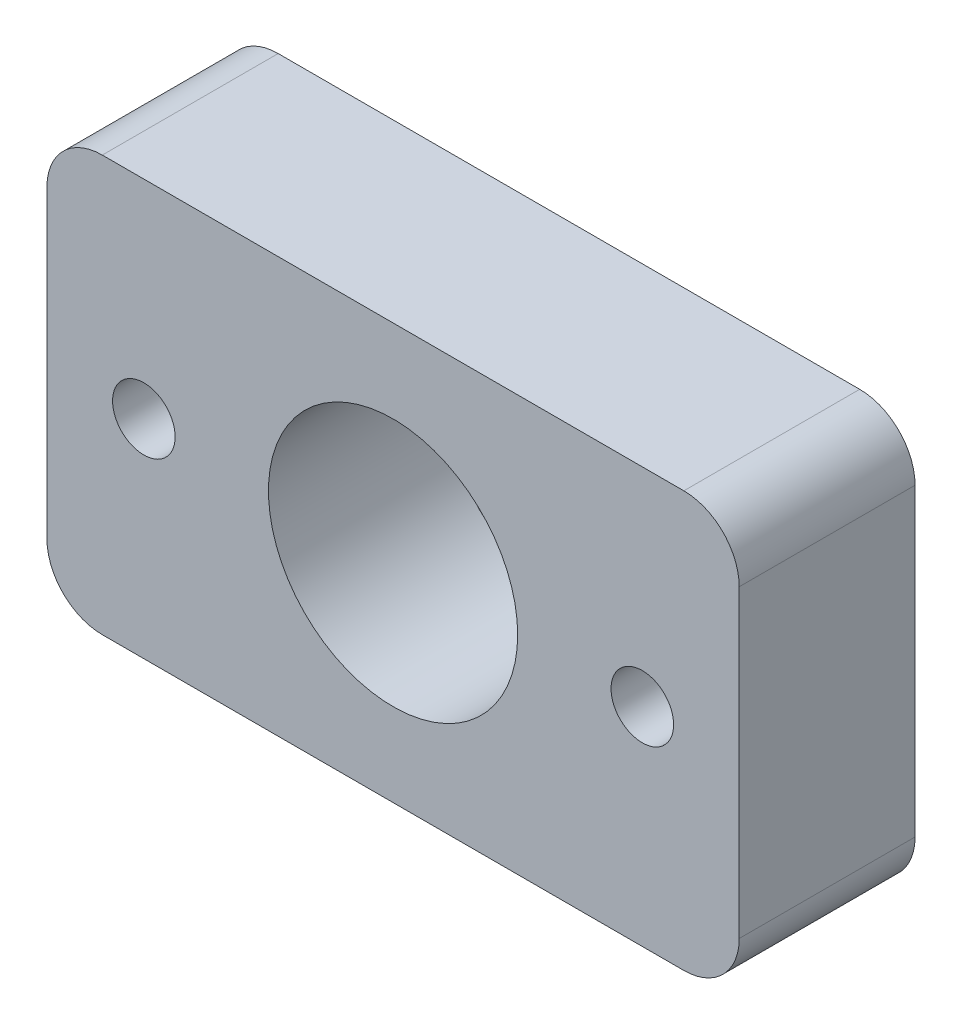
ISO-10303-21;
HEADER;
FILE_DESCRIPTION(('STEP AP214'),'2;1');
FILE_NAME('part.step','',(''),(''),'','','');
FILE_SCHEMA(('AUTOMOTIVE_DESIGN { 1 0 10303 214 1 1 1 1 }'));
ENDSEC;
DATA;
#1=APPLICATION_CONTEXT('core data for automotive mechanical design processes');
#2=APPLICATION_PROTOCOL_DEFINITION('international standard','automotive_design',2000,#1);
#3=PRODUCT_CONTEXT('',#1,'mechanical');
#4=PRODUCT('Part','Part','',(#3));
#5=PRODUCT_RELATED_PRODUCT_CATEGORY('part','',(#4));
#6=PRODUCT_DEFINITION_FORMATION('','',#4);
#7=PRODUCT_DEFINITION_CONTEXT('part definition',#1,'design');
#8=PRODUCT_DEFINITION('design','',#6,#7);
#9=PRODUCT_DEFINITION_SHAPE('','',#8);
#10=(LENGTH_UNIT() NAMED_UNIT(*) SI_UNIT(.MILLI.,.METRE.));
#11=(NAMED_UNIT(*) PLANE_ANGLE_UNIT() SI_UNIT($,.RADIAN.));
#12=(NAMED_UNIT(*) SI_UNIT($,.STERADIAN.) SOLID_ANGLE_UNIT());
#13=UNCERTAINTY_MEASURE_WITH_UNIT(LENGTH_MEASURE(1.E-05),#10,'distance_accuracy_value','');
#14=(GEOMETRIC_REPRESENTATION_CONTEXT(3) GLOBAL_UNCERTAINTY_ASSIGNED_CONTEXT((#13)) GLOBAL_UNIT_ASSIGNED_CONTEXT((#10,
#11,#12)) REPRESENTATION_CONTEXT('',''));
#15=CARTESIAN_POINT('',(0.,0.,0.));
#16=DIRECTION('',(0.,0.,1.));
#17=DIRECTION('',(1.,0.,0.));
#18=AXIS2_PLACEMENT_3D('',#15,#16,#17);
#19=CARTESIAN_POINT('',(0.,0.,6.35));
#20=DIRECTION('',(0.,0.,1.));
#21=DIRECTION('',(1.,0.,0.));
#22=AXIS2_PLACEMENT_3D('',#19,#20,#21);
#23=PLANE('',#22);
#24=CARTESIAN_POINT('',(3.5,-7.5,6.35));
#25=DIRECTION('',(0.,0.,1.));
#26=DIRECTION('',(1.,0.,0.));
#27=AXIS2_PLACEMENT_3D('',#24,#25,#26);
#28=CIRCLE('',#27,1.1303);
#29=CARTESIAN_POINT('',(4.6303,-7.5,6.35));
#30=VERTEX_POINT('',#29);
#31=EDGE_CURVE('E196',#30,#30,#28,.T.);
#32=ORIENTED_EDGE('',*,*,#31,.F.);
#33=EDGE_LOOP('',(#32));
#34=FACE_BOUND('',#33,.T.);
#35=DIRECTION('',(0.,-1.,0.));
#36=VECTOR('',#35,1.);
#37=CARTESIAN_POINT('',(0.,0.,6.35));
#38=LINE('',#37,#36);
#39=CARTESIAN_POINT('',(0.,-2.,6.35));
#40=VERTEX_POINT('',#39);
#41=CARTESIAN_POINT('',(0.,-13.,6.35));
#42=VERTEX_POINT('',#41);
#43=EDGE_CURVE('E150',#40,#42,#38,.T.);
#44=ORIENTED_EDGE('',*,*,#43,.T.);
#45=CARTESIAN_POINT('',(2.,-13.,6.35));
#46=DIRECTION('',(0.,0.,1.));
#47=DIRECTION('',(1.,0.,0.));
#48=AXIS2_PLACEMENT_3D('',#45,#46,#47);
#49=CIRCLE('',#48,2.);
#50=CARTESIAN_POINT('',(2.,-15.,6.35));
#51=VERTEX_POINT('',#50);
#52=EDGE_CURVE('E164',#42,#51,#49,.T.);
#53=ORIENTED_EDGE('',*,*,#52,.T.);
#54=DIRECTION('',(1.,0.,0.));
#55=VECTOR('',#54,1.);
#56=CARTESIAN_POINT('',(0.,-15.,6.35));
#57=LINE('',#56,#55);
#58=CARTESIAN_POINT('',(23.,-15.,6.35));
#59=VERTEX_POINT('',#58);
#60=EDGE_CURVE('E131',#51,#59,#57,.T.);
#61=ORIENTED_EDGE('',*,*,#60,.T.);
#62=CARTESIAN_POINT('',(23.,-13.,6.35));
#63=DIRECTION('',(0.,0.,1.));
#64=DIRECTION('',(1.,0.,0.));
#65=AXIS2_PLACEMENT_3D('',#62,#63,#64);
#66=CIRCLE('',#65,2.);
#67=CARTESIAN_POINT('',(25.,-13.,6.35));
#68=VERTEX_POINT('',#67);
#69=EDGE_CURVE('E160',#59,#68,#66,.T.);
#70=ORIENTED_EDGE('',*,*,#69,.T.);
#71=DIRECTION('',(0.,1.,0.));
#72=VECTOR('',#71,1.);
#73=CARTESIAN_POINT('',(25.,0.,6.35));
#74=LINE('',#73,#72);
#75=CARTESIAN_POINT('',(25.,-2.,6.35));
#76=VERTEX_POINT('',#75);
#77=EDGE_CURVE('E173',#68,#76,#74,.T.);
#78=ORIENTED_EDGE('',*,*,#77,.T.);
#79=CARTESIAN_POINT('',(23.,-2.,6.35));
#80=DIRECTION('',(0.,0.,1.));
#81=DIRECTION('',(1.,0.,0.));
#82=AXIS2_PLACEMENT_3D('',#79,#80,#81);
#83=CIRCLE('',#82,2.);
#84=CARTESIAN_POINT('',(23.,0.,6.35));
#85=VERTEX_POINT('',#84);
#86=EDGE_CURVE('E66',#76,#85,#83,.T.);
#87=ORIENTED_EDGE('',*,*,#86,.T.);
#88=DIRECTION('',(-1.,0.,0.));
#89=VECTOR('',#88,1.);
#90=CARTESIAN_POINT('',(0.,0.,6.35));
#91=LINE('',#90,#89);
#92=CARTESIAN_POINT('',(2.,0.,6.35));
#93=VERTEX_POINT('',#92);
#94=EDGE_CURVE('E151',#85,#93,#91,.T.);
#95=ORIENTED_EDGE('',*,*,#94,.T.);
#96=CARTESIAN_POINT('',(2.,-2.,6.35));
#97=DIRECTION('',(0.,0.,1.));
#98=DIRECTION('',(1.,0.,0.));
#99=AXIS2_PLACEMENT_3D('',#96,#97,#98);
#100=CIRCLE('',#99,2.);
#101=EDGE_CURVE('E162',#93,#40,#100,.T.);
#102=ORIENTED_EDGE('',*,*,#101,.T.);
#103=EDGE_LOOP('',(#44,#53,#61,#70,#78,#87,#95,#102));
#104=FACE_BOUND('',#103,.T.);
#105=CARTESIAN_POINT('',(12.5,-7.5,6.35));
#106=DIRECTION('',(0.,0.,1.));
#107=DIRECTION('',(1.,0.,0.));
#108=AXIS2_PLACEMENT_3D('',#105,#106,#107);
#109=CIRCLE('',#108,4.5);
#110=CARTESIAN_POINT('',(17.,-7.5,6.35));
#111=VERTEX_POINT('',#110);
#112=EDGE_CURVE('E145',#111,#111,#109,.T.);
#113=ORIENTED_EDGE('',*,*,#112,.F.);
#114=EDGE_LOOP('',(#113));
#115=FACE_BOUND('',#114,.T.);
#116=CARTESIAN_POINT('',(21.5,-7.5,6.35));
#117=DIRECTION('',(0.,0.,1.));
#118=DIRECTION('',(1.,0.,0.));
#119=AXIS2_PLACEMENT_3D('',#116,#117,#118);
#120=CIRCLE('',#119,1.1303);
#121=CARTESIAN_POINT('',(22.6303,-7.5,6.35));
#122=VERTEX_POINT('',#121);
#123=EDGE_CURVE('E202',#122,#122,#120,.T.);
#124=ORIENTED_EDGE('',*,*,#123,.F.);
#125=EDGE_LOOP('',(#124));
#126=FACE_BOUND('',#125,.T.);
#127=ADVANCED_FACE('F44',(#34,#104,#115,#126),#23,.T.);
#128=CARTESIAN_POINT('',(0.,0.,0.));
#129=DIRECTION('',(0.,0.,1.));
#130=DIRECTION('',(1.,0.,0.));
#131=AXIS2_PLACEMENT_3D('',#128,#129,#130);
#132=PLANE('',#131);
#133=DIRECTION('',(1.,0.,0.));
#134=VECTOR('',#133,1.);
#135=CARTESIAN_POINT('',(0.,-15.,0.));
#136=LINE('',#135,#134);
#137=CARTESIAN_POINT('',(2.,-15.,0.));
#138=VERTEX_POINT('',#137);
#139=CARTESIAN_POINT('',(23.,-15.,0.));
#140=VERTEX_POINT('',#139);
#141=EDGE_CURVE('E128',#138,#140,#136,.T.);
#142=ORIENTED_EDGE('',*,*,#141,.F.);
#143=CARTESIAN_POINT('',(2.,-13.,0.));
#144=DIRECTION('',(0.,0.,1.));
#145=DIRECTION('',(1.,0.,0.));
#146=AXIS2_PLACEMENT_3D('',#143,#144,#145);
#147=CIRCLE('',#146,2.);
#148=CARTESIAN_POINT('',(0.,-13.,0.));
#149=VERTEX_POINT('',#148);
#150=EDGE_CURVE('E111',#138,#149,#147,.F.);
#151=ORIENTED_EDGE('',*,*,#150,.T.);
#152=DIRECTION('',(0.,-1.,0.));
#153=VECTOR('',#152,1.);
#154=CARTESIAN_POINT('',(0.,0.,0.));
#155=LINE('',#154,#153);
#156=CARTESIAN_POINT('',(0.,-2.,0.));
#157=VERTEX_POINT('',#156);
#158=EDGE_CURVE('E140',#157,#149,#155,.T.);
#159=ORIENTED_EDGE('',*,*,#158,.F.);
#160=CARTESIAN_POINT('',(2.,-2.,0.));
#161=DIRECTION('',(0.,0.,1.));
#162=DIRECTION('',(1.,0.,0.));
#163=AXIS2_PLACEMENT_3D('',#160,#161,#162);
#164=CIRCLE('',#163,2.);
#165=CARTESIAN_POINT('',(2.,0.,0.));
#166=VERTEX_POINT('',#165);
#167=EDGE_CURVE('E122',#157,#166,#164,.F.);
#168=ORIENTED_EDGE('',*,*,#167,.T.);
#169=DIRECTION('',(-1.,0.,0.));
#170=VECTOR('',#169,1.);
#171=CARTESIAN_POINT('',(0.,0.,0.));
#172=LINE('',#171,#170);
#173=CARTESIAN_POINT('',(23.,0.,0.));
#174=VERTEX_POINT('',#173);
#175=EDGE_CURVE('E143',#174,#166,#172,.T.);
#176=ORIENTED_EDGE('',*,*,#175,.F.);
#177=CARTESIAN_POINT('',(23.,-2.,0.));
#178=DIRECTION('',(0.,0.,1.));
#179=DIRECTION('',(1.,0.,0.));
#180=AXIS2_PLACEMENT_3D('',#177,#178,#179);
#181=CIRCLE('',#180,2.);
#182=CARTESIAN_POINT('',(25.,-2.,0.));
#183=VERTEX_POINT('',#182);
#184=EDGE_CURVE('E132',#174,#183,#181,.F.);
#185=ORIENTED_EDGE('',*,*,#184,.T.);
#186=DIRECTION('',(0.,1.,0.));
#187=VECTOR('',#186,1.);
#188=CARTESIAN_POINT('',(25.,0.,0.));
#189=LINE('',#188,#187);
#190=CARTESIAN_POINT('',(25.,-13.,0.));
#191=VERTEX_POINT('',#190);
#192=EDGE_CURVE('E139',#191,#183,#189,.T.);
#193=ORIENTED_EDGE('',*,*,#192,.F.);
#194=CARTESIAN_POINT('',(23.,-13.,0.));
#195=DIRECTION('',(0.,0.,1.));
#196=DIRECTION('',(1.,0.,0.));
#197=AXIS2_PLACEMENT_3D('',#194,#195,#196);
#198=CIRCLE('',#197,2.);
#199=EDGE_CURVE('E138',#191,#140,#198,.F.);
#200=ORIENTED_EDGE('',*,*,#199,.T.);
#201=EDGE_LOOP('',(#142,#151,#159,#168,#176,#185,#193,#200));
#202=FACE_BOUND('',#201,.T.);
#203=CARTESIAN_POINT('',(12.5,-7.5,0.));
#204=DIRECTION('',(0.,0.,1.));
#205=DIRECTION('',(1.,0.,0.));
#206=AXIS2_PLACEMENT_3D('',#203,#204,#205);
#207=CIRCLE('',#206,4.5);
#208=CARTESIAN_POINT('',(17.,-7.5,0.));
#209=VERTEX_POINT('',#208);
#210=EDGE_CURVE('E193',#209,#209,#207,.T.);
#211=ORIENTED_EDGE('',*,*,#210,.T.);
#212=EDGE_LOOP('',(#211));
#213=FACE_BOUND('',#212,.T.);
#214=CARTESIAN_POINT('',(3.5,-7.5,0.));
#215=DIRECTION('',(0.,0.,1.));
#216=DIRECTION('',(1.,0.,0.));
#217=AXIS2_PLACEMENT_3D('',#214,#215,#216);
#218=CIRCLE('',#217,1.1303);
#219=CARTESIAN_POINT('',(4.6303,-7.5,0.));
#220=VERTEX_POINT('',#219);
#221=EDGE_CURVE('E199',#220,#220,#218,.T.);
#222=ORIENTED_EDGE('',*,*,#221,.T.);
#223=EDGE_LOOP('',(#222));
#224=FACE_BOUND('',#223,.T.);
#225=CARTESIAN_POINT('',(21.5,-7.5,0.));
#226=DIRECTION('',(0.,0.,1.));
#227=DIRECTION('',(1.,0.,0.));
#228=AXIS2_PLACEMENT_3D('',#225,#226,#227);
#229=CIRCLE('',#228,1.1303);
#230=CARTESIAN_POINT('',(22.6303,-7.5,0.));
#231=VERTEX_POINT('',#230);
#232=EDGE_CURVE('E205',#231,#231,#229,.T.);
#233=ORIENTED_EDGE('',*,*,#232,.T.);
#234=EDGE_LOOP('',(#233));
#235=FACE_BOUND('',#234,.T.);
#236=ADVANCED_FACE('F135',(#202,#213,#224,#235),#132,.F.);
#237=CARTESIAN_POINT('',(0.,0.,6.35));
#238=DIRECTION('',(1.,0.,0.));
#239=DIRECTION('',(0.,0.,-1.));
#240=AXIS2_PLACEMENT_3D('',#237,#238,#239);
#241=PLANE('',#240);
#242=ORIENTED_EDGE('',*,*,#158,.T.);
#243=DIRECTION('',(0.,0.,-1.));
#244=VECTOR('',#243,1.);
#245=CARTESIAN_POINT('',(0.,-13.,6.35));
#246=LINE('',#245,#244);
#247=EDGE_CURVE('E116',#149,#42,#246,.F.);
#248=ORIENTED_EDGE('',*,*,#247,.T.);
#249=ORIENTED_EDGE('',*,*,#43,.F.);
#250=DIRECTION('',(0.,0.,-1.));
#251=VECTOR('',#250,1.);
#252=CARTESIAN_POINT('',(0.,-2.,6.35));
#253=LINE('',#252,#251);
#254=EDGE_CURVE('E121',#40,#157,#253,.T.);
#255=ORIENTED_EDGE('',*,*,#254,.T.);
#256=EDGE_LOOP('',(#242,#248,#249,#255));
#257=FACE_BOUND('',#256,.T.);
#258=ADVANCED_FACE('F189',(#257),#241,.F.);
#259=CARTESIAN_POINT('',(0.,-15.,6.35));
#260=DIRECTION('',(0.,1.,0.));
#261=DIRECTION('',(0.,0.,1.));
#262=AXIS2_PLACEMENT_3D('',#259,#260,#261);
#263=PLANE('',#262);
#264=ORIENTED_EDGE('',*,*,#60,.F.);
#265=DIRECTION('',(0.,0.,-1.));
#266=VECTOR('',#265,1.);
#267=CARTESIAN_POINT('',(2.,-15.,6.35));
#268=LINE('',#267,#266);
#269=EDGE_CURVE('E115',#51,#138,#268,.T.);
#270=ORIENTED_EDGE('',*,*,#269,.T.);
#271=ORIENTED_EDGE('',*,*,#141,.T.);
#272=DIRECTION('',(0.,0.,-1.));
#273=VECTOR('',#272,1.);
#274=CARTESIAN_POINT('',(23.,-15.,6.35));
#275=LINE('',#274,#273);
#276=EDGE_CURVE('E133',#140,#59,#275,.F.);
#277=ORIENTED_EDGE('',*,*,#276,.T.);
#278=EDGE_LOOP('',(#264,#270,#271,#277));
#279=FACE_BOUND('',#278,.T.);
#280=ADVANCED_FACE('F127',(#279),#263,.F.);
#281=CARTESIAN_POINT('',(25.,0.,6.35));
#282=DIRECTION('',(-1.,0.,0.));
#283=DIRECTION('',(0.,0.,1.));
#284=AXIS2_PLACEMENT_3D('',#281,#282,#283);
#285=PLANE('',#284);
#286=ORIENTED_EDGE('',*,*,#77,.F.);
#287=DIRECTION('',(0.,0.,-1.));
#288=VECTOR('',#287,1.);
#289=CARTESIAN_POINT('',(25.,-13.,6.35));
#290=LINE('',#289,#288);
#291=EDGE_CURVE('E11',#68,#191,#290,.T.);
#292=ORIENTED_EDGE('',*,*,#291,.T.);
#293=ORIENTED_EDGE('',*,*,#192,.T.);
#294=DIRECTION('',(0.,0.,-1.));
#295=VECTOR('',#294,1.);
#296=CARTESIAN_POINT('',(25.,-2.,6.35));
#297=LINE('',#296,#295);
#298=EDGE_CURVE('E52',#183,#76,#297,.F.);
#299=ORIENTED_EDGE('',*,*,#298,.T.);
#300=EDGE_LOOP('',(#286,#292,#293,#299));
#301=FACE_BOUND('',#300,.T.);
#302=ADVANCED_FACE('F172',(#301),#285,.F.);
#303=CARTESIAN_POINT('',(0.,0.,6.35));
#304=DIRECTION('',(0.,-1.,0.));
#305=DIRECTION('',(0.,0.,-1.));
#306=AXIS2_PLACEMENT_3D('',#303,#304,#305);
#307=PLANE('',#306);
#308=ORIENTED_EDGE('',*,*,#175,.T.);
#309=DIRECTION('',(0.,0.,-1.));
#310=VECTOR('',#309,1.);
#311=CARTESIAN_POINT('',(2.,0.,6.35));
#312=LINE('',#311,#310);
#313=EDGE_CURVE('E59',#166,#93,#312,.F.);
#314=ORIENTED_EDGE('',*,*,#313,.T.);
#315=ORIENTED_EDGE('',*,*,#94,.F.);
#316=DIRECTION('',(0.,0.,-1.));
#317=VECTOR('',#316,1.);
#318=CARTESIAN_POINT('',(23.,0.,6.35));
#319=LINE('',#318,#317);
#320=EDGE_CURVE('E166',#85,#174,#319,.T.);
#321=ORIENTED_EDGE('',*,*,#320,.T.);
#322=EDGE_LOOP('',(#308,#314,#315,#321));
#323=FACE_BOUND('',#322,.T.);
#324=ADVANCED_FACE('F182',(#323),#307,.F.);
#325=CARTESIAN_POINT('',(12.5,-7.5,6.35));
#326=DIRECTION('',(0.,0.,-1.));
#327=DIRECTION('',(-1.,0.,0.));
#328=AXIS2_PLACEMENT_3D('',#325,#326,#327);
#329=CYLINDRICAL_SURFACE('',#328,4.5);
#330=ORIENTED_EDGE('',*,*,#112,.T.);
#331=EDGE_LOOP('',(#330));
#332=FACE_BOUND('',#331,.T.);
#333=ORIENTED_EDGE('',*,*,#210,.F.);
#334=EDGE_LOOP('',(#333));
#335=FACE_BOUND('',#334,.T.);
#336=ADVANCED_FACE('F224',(#332,#335),#329,.F.);
#337=CARTESIAN_POINT('',(3.5,-7.5,6.35));
#338=DIRECTION('',(0.,0.,-1.));
#339=DIRECTION('',(-1.,0.,0.));
#340=AXIS2_PLACEMENT_3D('',#337,#338,#339);
#341=CYLINDRICAL_SURFACE('',#340,1.1303);
#342=ORIENTED_EDGE('',*,*,#31,.T.);
#343=EDGE_LOOP('',(#342));
#344=FACE_BOUND('',#343,.T.);
#345=ORIENTED_EDGE('',*,*,#221,.F.);
#346=EDGE_LOOP('',(#345));
#347=FACE_BOUND('',#346,.T.);
#348=ADVANCED_FACE('F307',(#344,#347),#341,.F.);
#349=CARTESIAN_POINT('',(21.5,-7.5,6.35));
#350=DIRECTION('',(0.,0.,-1.));
#351=DIRECTION('',(-1.,0.,0.));
#352=AXIS2_PLACEMENT_3D('',#349,#350,#351);
#353=CYLINDRICAL_SURFACE('',#352,1.1303);
#354=ORIENTED_EDGE('',*,*,#123,.T.);
#355=EDGE_LOOP('',(#354));
#356=FACE_BOUND('',#355,.T.);
#357=ORIENTED_EDGE('',*,*,#232,.F.);
#358=EDGE_LOOP('',(#357));
#359=FACE_BOUND('',#358,.T.);
#360=ADVANCED_FACE('F211',(#356,#359),#353,.F.);
#361=CARTESIAN_POINT('',(2.,-13.,6.35));
#362=DIRECTION('',(0.,0.,-1.));
#363=DIRECTION('',(-1.,0.,0.));
#364=AXIS2_PLACEMENT_3D('',#361,#362,#363);
#365=CYLINDRICAL_SURFACE('',#364,2.);
#366=ORIENTED_EDGE('',*,*,#52,.F.);
#367=ORIENTED_EDGE('',*,*,#247,.F.);
#368=ORIENTED_EDGE('',*,*,#150,.F.);
#369=ORIENTED_EDGE('',*,*,#269,.F.);
#370=EDGE_LOOP('',(#366,#367,#368,#369));
#371=FACE_BOUND('',#370,.T.);
#372=ADVANCED_FACE('F114',(#371),#365,.T.);
#373=CARTESIAN_POINT('',(2.,-2.,6.35));
#374=DIRECTION('',(0.,0.,-1.));
#375=DIRECTION('',(-1.,0.,0.));
#376=AXIS2_PLACEMENT_3D('',#373,#374,#375);
#377=CYLINDRICAL_SURFACE('',#376,2.);
#378=ORIENTED_EDGE('',*,*,#101,.F.);
#379=ORIENTED_EDGE('',*,*,#313,.F.);
#380=ORIENTED_EDGE('',*,*,#167,.F.);
#381=ORIENTED_EDGE('',*,*,#254,.F.);
#382=EDGE_LOOP('',(#378,#379,#380,#381));
#383=FACE_BOUND('',#382,.T.);
#384=ADVANCED_FACE('F186',(#383),#377,.T.);
#385=CARTESIAN_POINT('',(23.,-13.,6.35));
#386=DIRECTION('',(0.,0.,-1.));
#387=DIRECTION('',(-1.,0.,0.));
#388=AXIS2_PLACEMENT_3D('',#385,#386,#387);
#389=CYLINDRICAL_SURFACE('',#388,2.);
#390=ORIENTED_EDGE('',*,*,#69,.F.);
#391=ORIENTED_EDGE('',*,*,#276,.F.);
#392=ORIENTED_EDGE('',*,*,#199,.F.);
#393=ORIENTED_EDGE('',*,*,#291,.F.);
#394=EDGE_LOOP('',(#390,#391,#392,#393));
#395=FACE_BOUND('',#394,.T.);
#396=ADVANCED_FACE('F238',(#395),#389,.T.);
#397=CARTESIAN_POINT('',(23.,-2.,6.35));
#398=DIRECTION('',(0.,0.,-1.));
#399=DIRECTION('',(-1.,0.,0.));
#400=AXIS2_PLACEMENT_3D('',#397,#398,#399);
#401=CYLINDRICAL_SURFACE('',#400,2.);
#402=ORIENTED_EDGE('',*,*,#86,.F.);
#403=ORIENTED_EDGE('',*,*,#298,.F.);
#404=ORIENTED_EDGE('',*,*,#184,.F.);
#405=ORIENTED_EDGE('',*,*,#320,.F.);
#406=EDGE_LOOP('',(#402,#403,#404,#405));
#407=FACE_BOUND('',#406,.T.);
#408=ADVANCED_FACE('F46',(#407),#401,.T.);
#409=CLOSED_SHELL('',(#127,#236,#258,#280,#302,#324,#336,#348,#360,#372,#384,#396,#408));
#410=MANIFOLD_SOLID_BREP('B2',#409);
#411=ADVANCED_BREP_SHAPE_REPRESENTATION('',(#18,#410),#14);
#412=SHAPE_DEFINITION_REPRESENTATION(#9,#411);
ENDSEC;
END-ISO-10303-21;
